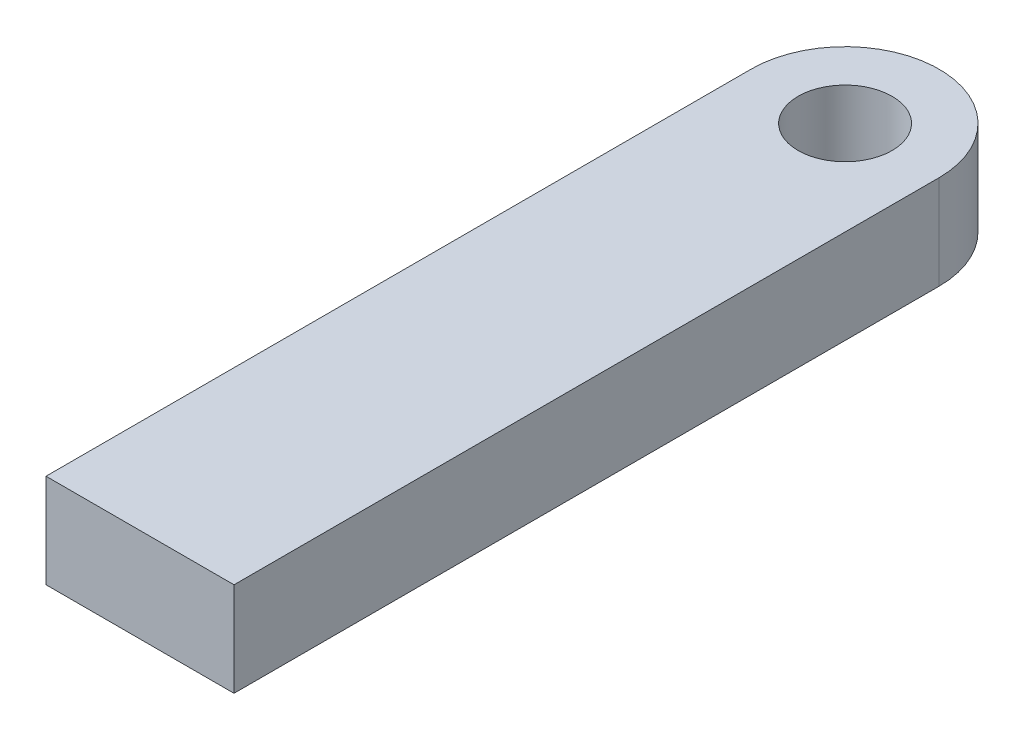
ISO-10303-21;
HEADER;
FILE_DESCRIPTION(('STEP AP214'),'2;1');
FILE_NAME('part.step','',(''),(''),'','','');
FILE_SCHEMA(('AUTOMOTIVE_DESIGN { 1 0 10303 214 1 1 1 1 }'));
ENDSEC;
DATA;
#1=APPLICATION_CONTEXT('core data for automotive mechanical design processes');
#2=APPLICATION_PROTOCOL_DEFINITION('international standard','automotive_design',2000,#1);
#3=PRODUCT_CONTEXT('',#1,'mechanical');
#4=PRODUCT('Part','Part','',(#3));
#5=PRODUCT_RELATED_PRODUCT_CATEGORY('part','',(#4));
#6=PRODUCT_DEFINITION_FORMATION('','',#4);
#7=PRODUCT_DEFINITION_CONTEXT('part definition',#1,'design');
#8=PRODUCT_DEFINITION('design','',#6,#7);
#9=PRODUCT_DEFINITION_SHAPE('','',#8);
#10=(LENGTH_UNIT() NAMED_UNIT(*) SI_UNIT(.MILLI.,.METRE.));
#11=(NAMED_UNIT(*) PLANE_ANGLE_UNIT() SI_UNIT($,.RADIAN.));
#12=(NAMED_UNIT(*) SI_UNIT($,.STERADIAN.) SOLID_ANGLE_UNIT());
#13=UNCERTAINTY_MEASURE_WITH_UNIT(LENGTH_MEASURE(1.E-05),#10,'distance_accuracy_value','');
#14=(GEOMETRIC_REPRESENTATION_CONTEXT(3) GLOBAL_UNCERTAINTY_ASSIGNED_CONTEXT((#13)) GLOBAL_UNIT_ASSIGNED_CONTEXT((#10,
#11,#12)) REPRESENTATION_CONTEXT('',''));
#15=CARTESIAN_POINT('',(0.,0.,0.));
#16=DIRECTION('',(0.,0.,1.));
#17=DIRECTION('',(1.,0.,0.));
#18=AXIS2_PLACEMENT_3D('',#15,#16,#17);
#19=CARTESIAN_POINT('',(-20.,10.,150.));
#20=DIRECTION('',(1.,0.,0.));
#21=DIRECTION('',(0.,1.,0.));
#22=AXIS2_PLACEMENT_3D('',#19,#20,#21);
#23=PLANE('',#22);
#24=DIRECTION('',(0.,-1.,0.));
#25=VECTOR('',#24,1.);
#26=CARTESIAN_POINT('',(-20.,10.,0.));
#27=LINE('',#26,#25);
#28=CARTESIAN_POINT('',(-20.,10.,0.));
#29=VERTEX_POINT('',#28);
#30=CARTESIAN_POINT('',(-20.,-10.,0.));
#31=VERTEX_POINT('',#30);
#32=EDGE_CURVE('E80',#29,#31,#27,.T.);
#33=ORIENTED_EDGE('',*,*,#32,.T.);
#34=DIRECTION('',(0.,0.,-1.));
#35=VECTOR('',#34,1.);
#36=CARTESIAN_POINT('',(-20.,-10.,150.));
#37=LINE('',#36,#35);
#38=CARTESIAN_POINT('',(-20.,-10.,150.));
#39=VERTEX_POINT('',#38);
#40=EDGE_CURVE('E11',#39,#31,#37,.T.);
#41=ORIENTED_EDGE('',*,*,#40,.F.);
#42=DIRECTION('',(0.,-1.,0.));
#43=VECTOR('',#42,1.);
#44=CARTESIAN_POINT('',(-20.,10.,150.));
#45=LINE('',#44,#43);
#46=CARTESIAN_POINT('',(-20.,10.,150.));
#47=VERTEX_POINT('',#46);
#48=EDGE_CURVE('E93',#47,#39,#45,.T.);
#49=ORIENTED_EDGE('',*,*,#48,.F.);
#50=DIRECTION('',(0.,0.,-1.));
#51=VECTOR('',#50,1.);
#52=CARTESIAN_POINT('',(-20.,10.,150.));
#53=LINE('',#52,#51);
#54=EDGE_CURVE('E96',#47,#29,#53,.T.);
#55=ORIENTED_EDGE('',*,*,#54,.T.);
#56=EDGE_LOOP('',(#33,#41,#49,#55));
#57=FACE_BOUND('',#56,.T.);
#58=ADVANCED_FACE('F37',(#57),#23,.F.);
#59=CARTESIAN_POINT('',(20.,-10.,150.));
#60=DIRECTION('',(0.,1.,0.));
#61=DIRECTION('',(-1.,0.,0.));
#62=AXIS2_PLACEMENT_3D('',#59,#60,#61);
#63=PLANE('',#62);
#64=CARTESIAN_POINT('',(0.,-10.,0.));
#65=DIRECTION('',(0.,1.,0.));
#66=DIRECTION('',(-1.,0.,0.));
#67=AXIS2_PLACEMENT_3D('',#64,#65,#66);
#68=CIRCLE('',#67,10.);
#69=CARTESIAN_POINT('',(-10.,-10.,0.));
#70=VERTEX_POINT('',#69);
#71=EDGE_CURVE('E109',#70,#70,#68,.T.);
#72=ORIENTED_EDGE('',*,*,#71,.T.);
#73=EDGE_LOOP('',(#72));
#74=FACE_BOUND('',#73,.T.);
#75=ORIENTED_EDGE('',*,*,#40,.T.);
#76=CARTESIAN_POINT('',(0.,-10.,0.));
#77=DIRECTION('',(0.,1.,0.));
#78=DIRECTION('',(-1.,0.,0.));
#79=AXIS2_PLACEMENT_3D('',#76,#77,#78);
#80=CIRCLE('',#79,20.);
#81=CARTESIAN_POINT('',(20.,-10.,0.));
#82=VERTEX_POINT('',#81);
#83=EDGE_CURVE('E84',#82,#31,#80,.T.);
#84=ORIENTED_EDGE('',*,*,#83,.F.);
#85=DIRECTION('',(0.,0.,-1.));
#86=VECTOR('',#85,1.);
#87=CARTESIAN_POINT('',(20.,-10.,150.));
#88=LINE('',#87,#86);
#89=CARTESIAN_POINT('',(20.,-10.,150.));
#90=VERTEX_POINT('',#89);
#91=EDGE_CURVE('E46',#90,#82,#88,.T.);
#92=ORIENTED_EDGE('',*,*,#91,.F.);
#93=DIRECTION('',(1.,0.,0.));
#94=VECTOR('',#93,1.);
#95=CARTESIAN_POINT('',(20.,-10.,150.));
#96=LINE('',#95,#94);
#97=EDGE_CURVE('E105',#39,#90,#96,.T.);
#98=ORIENTED_EDGE('',*,*,#97,.F.);
#99=EDGE_LOOP('',(#75,#84,#92,#98));
#100=FACE_BOUND('',#99,.T.);
#101=ADVANCED_FACE('F127',(#74,#100),#63,.F.);
#102=CARTESIAN_POINT('',(20.,10.,150.));
#103=DIRECTION('',(-1.,0.,0.));
#104=DIRECTION('',(0.,0.,1.));
#105=AXIS2_PLACEMENT_3D('',#102,#103,#104);
#106=PLANE('',#105);
#107=DIRECTION('',(0.,1.,0.));
#108=VECTOR('',#107,1.);
#109=CARTESIAN_POINT('',(20.,10.,0.));
#110=LINE('',#109,#108);
#111=CARTESIAN_POINT('',(20.,10.,0.));
#112=VERTEX_POINT('',#111);
#113=EDGE_CURVE('E77',#82,#112,#110,.T.);
#114=ORIENTED_EDGE('',*,*,#113,.T.);
#115=DIRECTION('',(0.,0.,-1.));
#116=VECTOR('',#115,1.);
#117=CARTESIAN_POINT('',(20.,10.,150.));
#118=LINE('',#117,#116);
#119=CARTESIAN_POINT('',(20.,10.,150.));
#120=VERTEX_POINT('',#119);
#121=EDGE_CURVE('E91',#120,#112,#118,.T.);
#122=ORIENTED_EDGE('',*,*,#121,.F.);
#123=DIRECTION('',(0.,1.,0.));
#124=VECTOR('',#123,1.);
#125=CARTESIAN_POINT('',(20.,10.,150.));
#126=LINE('',#125,#124);
#127=EDGE_CURVE('E103',#90,#120,#126,.T.);
#128=ORIENTED_EDGE('',*,*,#127,.F.);
#129=ORIENTED_EDGE('',*,*,#91,.T.);
#130=EDGE_LOOP('',(#114,#122,#128,#129));
#131=FACE_BOUND('',#130,.T.);
#132=ADVANCED_FACE('F89',(#131),#106,.F.);
#133=CARTESIAN_POINT('',(20.,10.,150.));
#134=DIRECTION('',(0.,-1.,0.));
#135=DIRECTION('',(1.,0.,0.));
#136=AXIS2_PLACEMENT_3D('',#133,#134,#135);
#137=PLANE('',#136);
#138=CARTESIAN_POINT('',(0.,10.,0.));
#139=DIRECTION('',(0.,-1.,0.));
#140=DIRECTION('',(1.,0.,0.));
#141=AXIS2_PLACEMENT_3D('',#138,#139,#140);
#142=CIRCLE('',#141,10.);
#143=CARTESIAN_POINT('',(10.,10.,0.));
#144=VERTEX_POINT('',#143);
#145=EDGE_CURVE('E40',#144,#144,#142,.T.);
#146=ORIENTED_EDGE('',*,*,#145,.T.);
#147=EDGE_LOOP('',(#146));
#148=FACE_BOUND('',#147,.T.);
#149=ORIENTED_EDGE('',*,*,#121,.T.);
#150=CARTESIAN_POINT('',(0.,10.,0.));
#151=DIRECTION('',(0.,1.,0.));
#152=DIRECTION('',(-1.,0.,0.));
#153=AXIS2_PLACEMENT_3D('',#150,#151,#152);
#154=CIRCLE('',#153,20.);
#155=EDGE_CURVE('E74',#112,#29,#154,.T.);
#156=ORIENTED_EDGE('',*,*,#155,.T.);
#157=ORIENTED_EDGE('',*,*,#54,.F.);
#158=DIRECTION('',(-1.,0.,0.));
#159=VECTOR('',#158,1.);
#160=CARTESIAN_POINT('',(20.,10.,150.));
#161=LINE('',#160,#159);
#162=EDGE_CURVE('E53',#120,#47,#161,.T.);
#163=ORIENTED_EDGE('',*,*,#162,.F.);
#164=EDGE_LOOP('',(#149,#156,#157,#163));
#165=FACE_BOUND('',#164,.T.);
#166=ADVANCED_FACE('F95',(#148,#165),#137,.F.);
#167=CARTESIAN_POINT('',(0.,0.,150.));
#168=DIRECTION('',(0.,0.,-1.));
#169=DIRECTION('',(-1.,0.,0.));
#170=AXIS2_PLACEMENT_3D('',#167,#168,#169);
#171=PLANE('',#170);
#172=ORIENTED_EDGE('',*,*,#48,.T.);
#173=ORIENTED_EDGE('',*,*,#97,.T.);
#174=ORIENTED_EDGE('',*,*,#127,.T.);
#175=ORIENTED_EDGE('',*,*,#162,.T.);
#176=EDGE_LOOP('',(#172,#173,#174,#175));
#177=FACE_BOUND('',#176,.T.);
#178=ADVANCED_FACE('F124',(#177),#171,.F.);
#179=CARTESIAN_POINT('',(0.,-10.,0.));
#180=DIRECTION('',(0.,1.,0.));
#181=DIRECTION('',(-1.,0.,0.));
#182=AXIS2_PLACEMENT_3D('',#179,#180,#181);
#183=CYLINDRICAL_SURFACE('',#182,20.);
#184=ORIENTED_EDGE('',*,*,#83,.T.);
#185=ORIENTED_EDGE('',*,*,#32,.F.);
#186=ORIENTED_EDGE('',*,*,#155,.F.);
#187=ORIENTED_EDGE('',*,*,#113,.F.);
#188=EDGE_LOOP('',(#184,#185,#186,#187));
#189=FACE_BOUND('',#188,.T.);
#190=ADVANCED_FACE('F76',(#189),#183,.T.);
#191=CARTESIAN_POINT('',(0.,-10.,0.));
#192=DIRECTION('',(0.,1.,0.));
#193=DIRECTION('',(-1.,0.,0.));
#194=AXIS2_PLACEMENT_3D('',#191,#192,#193);
#195=CYLINDRICAL_SURFACE('',#194,10.);
#196=ORIENTED_EDGE('',*,*,#71,.F.);
#197=EDGE_LOOP('',(#196));
#198=FACE_BOUND('',#197,.T.);
#199=ORIENTED_EDGE('',*,*,#145,.F.);
#200=EDGE_LOOP('',(#199));
#201=FACE_BOUND('',#200,.T.);
#202=ADVANCED_FACE('F117',(#198,#201),#195,.F.);
#203=CLOSED_SHELL('',(#58,#101,#132,#166,#178,#190,#202));
#204=MANIFOLD_SOLID_BREP('B2',#203);
#205=ADVANCED_BREP_SHAPE_REPRESENTATION('',(#18,#204),#14);
#206=SHAPE_DEFINITION_REPRESENTATION(#9,#205);
ENDSEC;
END-ISO-10303-21;
